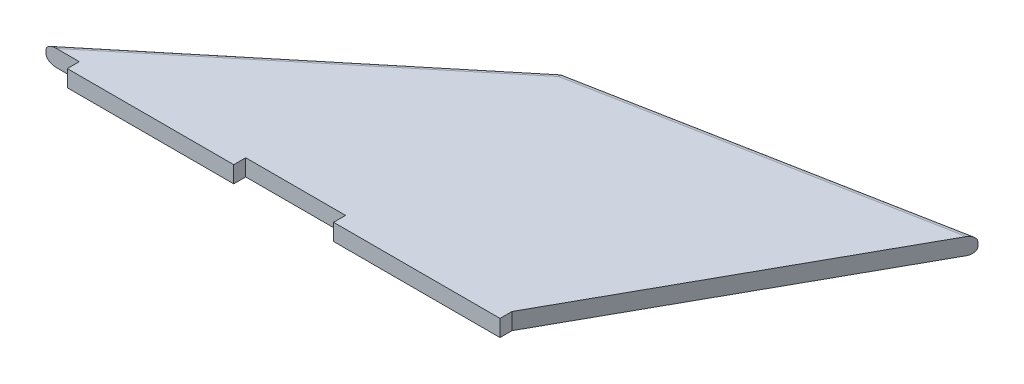
ISO-10303-21;
HEADER;
FILE_DESCRIPTION(('STEP AP214'),'2;1');
FILE_NAME('part.step','',(''),(''),'','','');
FILE_SCHEMA(('AUTOMOTIVE_DESIGN { 1 0 10303 214 1 1 1 1 }'));
ENDSEC;
DATA;
#1=APPLICATION_CONTEXT('core data for automotive mechanical design processes');
#2=APPLICATION_PROTOCOL_DEFINITION('international standard','automotive_design',2000,#1);
#3=PRODUCT_CONTEXT('',#1,'mechanical');
#4=PRODUCT('Part','Part','',(#3));
#5=PRODUCT_RELATED_PRODUCT_CATEGORY('part','',(#4));
#6=PRODUCT_DEFINITION_FORMATION('','',#4);
#7=PRODUCT_DEFINITION_CONTEXT('part definition',#1,'design');
#8=PRODUCT_DEFINITION('design','',#6,#7);
#9=PRODUCT_DEFINITION_SHAPE('','',#8);
#10=(LENGTH_UNIT() NAMED_UNIT(*) SI_UNIT(.MILLI.,.METRE.));
#11=(NAMED_UNIT(*) PLANE_ANGLE_UNIT() SI_UNIT($,.RADIAN.));
#12=(NAMED_UNIT(*) SI_UNIT($,.STERADIAN.) SOLID_ANGLE_UNIT());
#13=UNCERTAINTY_MEASURE_WITH_UNIT(LENGTH_MEASURE(1.E-05),#10,'distance_accuracy_value','');
#14=(GEOMETRIC_REPRESENTATION_CONTEXT(3) GLOBAL_UNCERTAINTY_ASSIGNED_CONTEXT((#13)) GLOBAL_UNIT_ASSIGNED_CONTEXT((#10,
#11,#12)) REPRESENTATION_CONTEXT('',''));
#15=CARTESIAN_POINT('',(0.,0.,0.));
#16=DIRECTION('',(0.,0.,1.));
#17=DIRECTION('',(1.,0.,0.));
#18=AXIS2_PLACEMENT_3D('',#15,#16,#17);
#19=CARTESIAN_POINT('',(5.,2.5,0.));
#20=DIRECTION('',(0.,0.,-1.));
#21=DIRECTION('',(-1.,0.,0.));
#22=AXIS2_PLACEMENT_3D('',#19,#20,#21);
#23=PLANE('',#22);
#24=DIRECTION('',(1.,0.,0.));
#25=VECTOR('',#24,1.);
#26=CARTESIAN_POINT('',(5.,2.5,0.));
#27=LINE('',#26,#25);
#28=CARTESIAN_POINT('',(1.57305111039609,2.5,0.));
#29=VERTEX_POINT('',#28);
#30=CARTESIAN_POINT('',(5.,2.5,0.));
#31=VERTEX_POINT('',#30);
#32=EDGE_CURVE('E141',#29,#31,#27,.T.);
#33=ORIENTED_EDGE('',*,*,#32,.F.);
#34=CARTESIAN_POINT('',(1.57305111039609,1.5,0.));
#35=DIRECTION('',(0.,0.,-1.));
#36=DIRECTION('',(1.,0.,0.));
#37=AXIS2_PLACEMENT_3D('',#34,#35,#36);
#38=ELLIPSE('',#37,1.57305111039609,1.);
#39=CARTESIAN_POINT('',(0.,1.5,0.));
#40=VERTEX_POINT('',#39);
#41=EDGE_CURVE('E187',#29,#40,#38,.F.);
#42=ORIENTED_EDGE('',*,*,#41,.T.);
#43=DIRECTION('',(0.,-1.,0.));
#44=VECTOR('',#43,1.);
#45=CARTESIAN_POINT('',(0.,2.5,0.));
#46=LINE('',#45,#44);
#47=CARTESIAN_POINT('',(0.,1.,0.));
#48=VERTEX_POINT('',#47);
#49=EDGE_CURVE('E229',#40,#48,#46,.T.);
#50=ORIENTED_EDGE('',*,*,#49,.T.);
#51=CARTESIAN_POINT('',(1.57305111039609,1.,0.));
#52=DIRECTION('',(0.,0.,-1.));
#53=DIRECTION('',(-1.,0.,0.));
#54=AXIS2_PLACEMENT_3D('',#51,#52,#53);
#55=ELLIPSE('',#54,1.57305111039609,1.);
#56=CARTESIAN_POINT('',(1.57305111039608,0.,0.));
#57=VERTEX_POINT('',#56);
#58=EDGE_CURVE('E185',#48,#57,#55,.F.);
#59=ORIENTED_EDGE('',*,*,#58,.T.);
#60=DIRECTION('',(1.,0.,0.));
#61=VECTOR('',#60,1.);
#62=CARTESIAN_POINT('',(5.,0.,0.));
#63=LINE('',#62,#61);
#64=CARTESIAN_POINT('',(5.,0.,0.));
#65=VERTEX_POINT('',#64);
#66=EDGE_CURVE('E162',#57,#65,#63,.T.);
#67=ORIENTED_EDGE('',*,*,#66,.T.);
#68=DIRECTION('',(0.,-1.,0.));
#69=VECTOR('',#68,1.);
#70=CARTESIAN_POINT('',(5.,2.5,0.));
#71=LINE('',#70,#69);
#72=EDGE_CURVE('E156',#31,#65,#71,.T.);
#73=ORIENTED_EDGE('',*,*,#72,.F.);
#74=EDGE_LOOP('',(#33,#42,#50,#59,#67,#73));
#75=FACE_BOUND('',#74,.T.);
#76=ADVANCED_FACE('F34',(#75),#23,.F.);
#77=CARTESIAN_POINT('',(5.,2.5,0.));
#78=DIRECTION('',(1.,0.,0.));
#79=DIRECTION('',(0.,0.,-1.));
#80=AXIS2_PLACEMENT_3D('',#77,#78,#79);
#81=PLANE('',#80);
#82=DIRECTION('',(0.,0.,1.));
#83=VECTOR('',#82,1.);
#84=CARTESIAN_POINT('',(5.,0.,0.));
#85=LINE('',#84,#83);
#86=CARTESIAN_POINT('',(5.,0.,1.80000000000001));
#87=VERTEX_POINT('',#86);
#88=EDGE_CURVE('E209',#65,#87,#85,.T.);
#89=ORIENTED_EDGE('',*,*,#88,.T.);
#90=DIRECTION('',(0.,-1.,0.));
#91=VECTOR('',#90,1.);
#92=CARTESIAN_POINT('',(5.,2.5,1.80000000000001));
#93=LINE('',#92,#91);
#94=CARTESIAN_POINT('',(5.,2.5,1.80000000000001));
#95=VERTEX_POINT('',#94);
#96=EDGE_CURVE('E158',#95,#87,#93,.T.);
#97=ORIENTED_EDGE('',*,*,#96,.F.);
#98=DIRECTION('',(0.,0.,1.));
#99=VECTOR('',#98,1.);
#100=CARTESIAN_POINT('',(5.,2.5,0.));
#101=LINE('',#100,#99);
#102=EDGE_CURVE('E144',#31,#95,#101,.T.);
#103=ORIENTED_EDGE('',*,*,#102,.F.);
#104=ORIENTED_EDGE('',*,*,#72,.T.);
#105=EDGE_LOOP('',(#89,#97,#103,#104));
#106=FACE_BOUND('',#105,.T.);
#107=ADVANCED_FACE('F155',(#106),#81,.F.);
#108=CARTESIAN_POINT('',(5.,2.5,1.80000000000001));
#109=DIRECTION('',(0.,0.,-1.));
#110=DIRECTION('',(-1.,0.,0.));
#111=AXIS2_PLACEMENT_3D('',#108,#109,#110);
#112=PLANE('',#111);
#113=DIRECTION('',(1.,0.,0.));
#114=VECTOR('',#113,1.);
#115=CARTESIAN_POINT('',(5.,0.,1.80000000000001));
#116=LINE('',#115,#114);
#117=CARTESIAN_POINT('',(30.,0.,1.80000000000001));
#118=VERTEX_POINT('',#117);
#119=EDGE_CURVE('E211',#87,#118,#116,.T.);
#120=ORIENTED_EDGE('',*,*,#119,.T.);
#121=DIRECTION('',(0.,-1.,0.));
#122=VECTOR('',#121,1.);
#123=CARTESIAN_POINT('',(30.,2.5,1.80000000000001));
#124=LINE('',#123,#122);
#125=CARTESIAN_POINT('',(30.,2.5,1.80000000000001));
#126=VERTEX_POINT('',#125);
#127=EDGE_CURVE('E168',#126,#118,#124,.T.);
#128=ORIENTED_EDGE('',*,*,#127,.F.);
#129=DIRECTION('',(1.,0.,0.));
#130=VECTOR('',#129,1.);
#131=CARTESIAN_POINT('',(5.,2.5,1.80000000000001));
#132=LINE('',#131,#130);
#133=EDGE_CURVE('E160',#95,#126,#132,.T.);
#134=ORIENTED_EDGE('',*,*,#133,.F.);
#135=ORIENTED_EDGE('',*,*,#96,.T.);
#136=EDGE_LOOP('',(#120,#128,#134,#135));
#137=FACE_BOUND('',#136,.T.);
#138=ADVANCED_FACE('F330',(#137),#112,.F.);
#139=CARTESIAN_POINT('',(30.,2.5,0.));
#140=DIRECTION('',(-1.,0.,0.));
#141=DIRECTION('',(0.,0.,1.));
#142=AXIS2_PLACEMENT_3D('',#139,#140,#141);
#143=PLANE('',#142);
#144=DIRECTION('',(0.,0.,-1.));
#145=VECTOR('',#144,1.);
#146=CARTESIAN_POINT('',(30.,0.,0.));
#147=LINE('',#146,#145);
#148=CARTESIAN_POINT('',(30.,0.,0.));
#149=VERTEX_POINT('',#148);
#150=EDGE_CURVE('E218',#118,#149,#147,.T.);
#151=ORIENTED_EDGE('',*,*,#150,.T.);
#152=DIRECTION('',(0.,-1.,0.));
#153=VECTOR('',#152,1.);
#154=CARTESIAN_POINT('',(30.,2.5,0.));
#155=LINE('',#154,#153);
#156=CARTESIAN_POINT('',(30.,2.5,0.));
#157=VERTEX_POINT('',#156);
#158=EDGE_CURVE('E247',#157,#149,#155,.T.);
#159=ORIENTED_EDGE('',*,*,#158,.F.);
#160=DIRECTION('',(0.,0.,-1.));
#161=VECTOR('',#160,1.);
#162=CARTESIAN_POINT('',(30.,2.5,0.));
#163=LINE('',#162,#161);
#164=EDGE_CURVE('E256',#126,#157,#163,.T.);
#165=ORIENTED_EDGE('',*,*,#164,.F.);
#166=ORIENTED_EDGE('',*,*,#127,.T.);
#167=EDGE_LOOP('',(#151,#159,#165,#166));
#168=FACE_BOUND('',#167,.T.);
#169=ADVANCED_FACE('F254',(#168),#143,.F.);
#170=CARTESIAN_POINT('',(45.,2.5,0.));
#171=DIRECTION('',(0.,0.,-1.));
#172=DIRECTION('',(-1.,0.,0.));
#173=AXIS2_PLACEMENT_3D('',#170,#171,#172);
#174=PLANE('',#173);
#175=DIRECTION('',(1.,0.,0.));
#176=VECTOR('',#175,1.);
#177=CARTESIAN_POINT('',(45.,0.,0.));
#178=LINE('',#177,#176);
#179=CARTESIAN_POINT('',(45.,0.,0.));
#180=VERTEX_POINT('',#179);
#181=EDGE_CURVE('E220',#149,#180,#178,.T.);
#182=ORIENTED_EDGE('',*,*,#181,.T.);
#183=DIRECTION('',(0.,-1.,0.));
#184=VECTOR('',#183,1.);
#185=CARTESIAN_POINT('',(45.,2.5,0.));
#186=LINE('',#185,#184);
#187=CARTESIAN_POINT('',(45.,2.5,0.));
#188=VERTEX_POINT('',#187);
#189=EDGE_CURVE('E244',#188,#180,#186,.T.);
#190=ORIENTED_EDGE('',*,*,#189,.F.);
#191=DIRECTION('',(1.,0.,0.));
#192=VECTOR('',#191,1.);
#193=CARTESIAN_POINT('',(45.,2.5,0.));
#194=LINE('',#193,#192);
#195=EDGE_CURVE('E274',#157,#188,#194,.T.);
#196=ORIENTED_EDGE('',*,*,#195,.F.);
#197=ORIENTED_EDGE('',*,*,#158,.T.);
#198=EDGE_LOOP('',(#182,#190,#196,#197));
#199=FACE_BOUND('',#198,.T.);
#200=ADVANCED_FACE('F265',(#199),#174,.F.);
#201=CARTESIAN_POINT('',(45.,2.5,0.));
#202=DIRECTION('',(1.,0.,0.));
#203=DIRECTION('',(0.,0.,-1.));
#204=AXIS2_PLACEMENT_3D('',#201,#202,#203);
#205=PLANE('',#204);
#206=DIRECTION('',(0.,0.,1.));
#207=VECTOR('',#206,1.);
#208=CARTESIAN_POINT('',(45.,0.,0.));
#209=LINE('',#208,#207);
#210=CARTESIAN_POINT('',(45.,0.,1.80000000000001));
#211=VERTEX_POINT('',#210);
#212=EDGE_CURVE('E222',#180,#211,#209,.T.);
#213=ORIENTED_EDGE('',*,*,#212,.T.);
#214=DIRECTION('',(0.,-1.,0.));
#215=VECTOR('',#214,1.);
#216=CARTESIAN_POINT('',(45.,2.5,1.80000000000001));
#217=LINE('',#216,#215);
#218=CARTESIAN_POINT('',(45.,2.5,1.80000000000001));
#219=VERTEX_POINT('',#218);
#220=EDGE_CURVE('E241',#219,#211,#217,.T.);
#221=ORIENTED_EDGE('',*,*,#220,.F.);
#222=DIRECTION('',(0.,0.,1.));
#223=VECTOR('',#222,1.);
#224=CARTESIAN_POINT('',(45.,2.5,0.));
#225=LINE('',#224,#223);
#226=EDGE_CURVE('E271',#188,#219,#225,.T.);
#227=ORIENTED_EDGE('',*,*,#226,.F.);
#228=ORIENTED_EDGE('',*,*,#189,.T.);
#229=EDGE_LOOP('',(#213,#221,#227,#228));
#230=FACE_BOUND('',#229,.T.);
#231=ADVANCED_FACE('F269',(#230),#205,.F.);
#232=CARTESIAN_POINT('',(45.,2.5,1.80000000000001));
#233=DIRECTION('',(0.,0.,-1.));
#234=DIRECTION('',(-1.,0.,0.));
#235=AXIS2_PLACEMENT_3D('',#232,#233,#234);
#236=PLANE('',#235);
#237=DIRECTION('',(1.,0.,0.));
#238=VECTOR('',#237,1.);
#239=CARTESIAN_POINT('',(45.,0.,1.80000000000001));
#240=LINE('',#239,#238);
#241=CARTESIAN_POINT('',(70.,0.,1.80000000000001));
#242=VERTEX_POINT('',#241);
#243=EDGE_CURVE('E224',#211,#242,#240,.T.);
#244=ORIENTED_EDGE('',*,*,#243,.T.);
#245=DIRECTION('',(0.,-1.,0.));
#246=VECTOR('',#245,1.);
#247=CARTESIAN_POINT('',(70.,2.5,1.80000000000001));
#248=LINE('',#247,#246);
#249=CARTESIAN_POINT('',(70.,2.5,1.80000000000001));
#250=VERTEX_POINT('',#249);
#251=EDGE_CURVE('E238',#250,#242,#248,.T.);
#252=ORIENTED_EDGE('',*,*,#251,.F.);
#253=DIRECTION('',(1.,0.,0.));
#254=VECTOR('',#253,1.);
#255=CARTESIAN_POINT('',(45.,2.5,1.80000000000001));
#256=LINE('',#255,#254);
#257=EDGE_CURVE('E273',#219,#250,#256,.T.);
#258=ORIENTED_EDGE('',*,*,#257,.F.);
#259=ORIENTED_EDGE('',*,*,#220,.T.);
#260=EDGE_LOOP('',(#244,#252,#258,#259));
#261=FACE_BOUND('',#260,.T.);
#262=ADVANCED_FACE('F428',(#261),#236,.F.);
#263=CARTESIAN_POINT('',(70.,2.5,0.));
#264=DIRECTION('',(-1.,0.,0.));
#265=DIRECTION('',(0.,0.,1.));
#266=AXIS2_PLACEMENT_3D('',#263,#264,#265);
#267=PLANE('',#266);
#268=DIRECTION('',(0.,0.,-1.));
#269=VECTOR('',#268,1.);
#270=CARTESIAN_POINT('',(70.,0.,0.));
#271=LINE('',#270,#269);
#272=CARTESIAN_POINT('',(70.,0.,0.));
#273=VERTEX_POINT('',#272);
#274=EDGE_CURVE('E226',#242,#273,#271,.T.);
#275=ORIENTED_EDGE('',*,*,#274,.T.);
#276=DIRECTION('',(0.,-1.,0.));
#277=VECTOR('',#276,1.);
#278=CARTESIAN_POINT('',(70.,2.5,0.));
#279=LINE('',#278,#277);
#280=CARTESIAN_POINT('',(70.,2.5,0.));
#281=VERTEX_POINT('',#280);
#282=EDGE_CURVE('E235',#281,#273,#279,.T.);
#283=ORIENTED_EDGE('',*,*,#282,.F.);
#284=DIRECTION('',(0.,0.,-1.));
#285=VECTOR('',#284,1.);
#286=CARTESIAN_POINT('',(70.,2.5,0.));
#287=LINE('',#286,#285);
#288=EDGE_CURVE('E276',#250,#281,#287,.T.);
#289=ORIENTED_EDGE('',*,*,#288,.F.);
#290=ORIENTED_EDGE('',*,*,#251,.T.);
#291=EDGE_LOOP('',(#275,#283,#289,#290));
#292=FACE_BOUND('',#291,.T.);
#293=ADVANCED_FACE('F413',(#292),#267,.F.);
#294=CARTESIAN_POINT('',(95.,2.5,-45.));
#295=DIRECTION('',(-0.874157276121538,0.,-0.485642931178632));
#296=DIRECTION('',(-0.485642931178632,0.,0.874157276121538));
#297=AXIS2_PLACEMENT_3D('',#294,#295,#296);
#298=PLANE('',#297);
#299=DIRECTION('',(0.485642931178632,0.,-0.874157276121538));
#300=VECTOR('',#299,1.);
#301=CARTESIAN_POINT('',(95.,0.,-45.));
#302=LINE('',#301,#300);
#303=CARTESIAN_POINT('',(94.3675278601647,0.,-43.8615501482965));
#304=VERTEX_POINT('',#303);
#305=EDGE_CURVE('E151',#273,#304,#302,.T.);
#306=ORIENTED_EDGE('',*,*,#305,.T.);
#307=CARTESIAN_POINT('',(94.3675278601647,1.,-43.8615501482965));
#308=DIRECTION('',(-0.874157276121538,0.,-0.485642931178632));
#309=DIRECTION('',(-0.485642931178632,0.,0.874157276121538));
#310=AXIS2_PLACEMENT_3D('',#307,#308,#309);
#311=ELLIPSE('',#310,1.3023398452445,1.);
#312=CARTESIAN_POINT('',(95.,1.,-45.));
#313=VERTEX_POINT('',#312);
#314=EDGE_CURVE('E11',#304,#313,#311,.F.);
#315=ORIENTED_EDGE('',*,*,#314,.T.);
#316=DIRECTION('',(0.,-1.,0.));
#317=VECTOR('',#316,1.);
#318=CARTESIAN_POINT('',(95.,2.5,-45.));
#319=LINE('',#318,#317);
#320=CARTESIAN_POINT('',(95.,1.5,-45.));
#321=VERTEX_POINT('',#320);
#322=EDGE_CURVE('E232',#321,#313,#319,.T.);
#323=ORIENTED_EDGE('',*,*,#322,.F.);
#324=CARTESIAN_POINT('',(94.3675278601647,1.5,-43.8615501482965));
#325=DIRECTION('',(-0.874157276121538,0.,-0.485642931178632));
#326=DIRECTION('',(0.485642931178632,0.,-0.874157276121538));
#327=AXIS2_PLACEMENT_3D('',#324,#325,#326);
#328=ELLIPSE('',#327,1.3023398452445,1.);
#329=CARTESIAN_POINT('',(94.3675278601647,2.5,-43.8615501482965));
#330=VERTEX_POINT('',#329);
#331=EDGE_CURVE('E43',#321,#330,#328,.F.);
#332=ORIENTED_EDGE('',*,*,#331,.T.);
#333=DIRECTION('',(0.485642931178632,0.,-0.874157276121538));
#334=VECTOR('',#333,1.);
#335=CARTESIAN_POINT('',(95.,2.5,-45.));
#336=LINE('',#335,#334);
#337=EDGE_CURVE('E214',#281,#330,#336,.T.);
#338=ORIENTED_EDGE('',*,*,#337,.F.);
#339=ORIENTED_EDGE('',*,*,#282,.T.);
#340=EDGE_LOOP('',(#306,#315,#323,#332,#338,#339));
#341=FACE_BOUND('',#340,.T.);
#342=ADVANCED_FACE('F294',(#341),#298,.F.);
#343=CARTESIAN_POINT('',(42.5,2.5,-35.));
#344=DIRECTION('',(0.187112107889995,0.,0.982338566422475));
#345=DIRECTION('',(0.982338566422475,0.,-0.187112107889995));
#346=AXIS2_PLACEMENT_3D('',#343,#344,#345);
#347=PLANE('',#346);
#348=ORIENTED_EDGE('',*,*,#322,.T.);
#349=DIRECTION('',(-0.982338566422475,0.,0.187112107889995));
#350=VECTOR('',#349,1.);
#351=CARTESIAN_POINT('',(42.5,1.,-35.));
#352=LINE('',#351,#350);
#353=CARTESIAN_POINT('',(42.7511999934689,1.,-35.0478476178036));
#354=VERTEX_POINT('',#353);
#355=EDGE_CURVE('E180',#313,#354,#352,.T.);
#356=ORIENTED_EDGE('',*,*,#355,.T.);
#357=DIRECTION('',(0.,-1.,0.));
#358=VECTOR('',#357,1.);
#359=CARTESIAN_POINT('',(42.7511999934689,2.5,-35.0478476178036));
#360=LINE('',#359,#358);
#361=CARTESIAN_POINT('',(42.7511999934689,1.5,-35.0478476178036));
#362=VERTEX_POINT('',#361);
#363=EDGE_CURVE('E178',#354,#362,#360,.F.);
#364=ORIENTED_EDGE('',*,*,#363,.T.);
#365=DIRECTION('',(-0.982338566422475,0.,0.187112107889995));
#366=VECTOR('',#365,1.);
#367=CARTESIAN_POINT('',(95.,1.5,-45.));
#368=LINE('',#367,#366);
#369=EDGE_CURVE('E176',#362,#321,#368,.F.);
#370=ORIENTED_EDGE('',*,*,#369,.T.);
#371=EDGE_LOOP('',(#348,#356,#364,#370));
#372=FACE_BOUND('',#371,.T.);
#373=ADVANCED_FACE('F291',(#372),#347,.F.);
#374=CARTESIAN_POINT('',(0.,2.5,0.));
#375=DIRECTION('',(0.6357072528611,0.,0.77193023561705));
#376=DIRECTION('',(0.77193023561705,0.,-0.6357072528611));
#377=AXIS2_PLACEMENT_3D('',#374,#375,#376);
#378=PLANE('',#377);
#379=ORIENTED_EDGE('',*,*,#49,.F.);
#380=DIRECTION('',(-0.77193023561705,0.,0.6357072528611));
#381=VECTOR('',#380,1.);
#382=CARTESIAN_POINT('',(42.5,1.5,-35.));
#383=LINE('',#382,#381);
#384=CARTESIAN_POINT('',(42.3026048484978,1.5,-34.8374392869982));
#385=VERTEX_POINT('',#384);
#386=EDGE_CURVE('E174',#40,#385,#383,.F.);
#387=ORIENTED_EDGE('',*,*,#386,.T.);
#388=DIRECTION('',(0.,-1.,0.));
#389=VECTOR('',#388,1.);
#390=CARTESIAN_POINT('',(42.3026048484978,2.5,-34.8374392869982));
#391=LINE('',#390,#389);
#392=CARTESIAN_POINT('',(42.3026048484978,1.,-34.8374392869982));
#393=VERTEX_POINT('',#392);
#394=EDGE_CURVE('E166',#385,#393,#391,.T.);
#395=ORIENTED_EDGE('',*,*,#394,.T.);
#396=DIRECTION('',(-0.77193023561705,0.,0.6357072528611));
#397=VECTOR('',#396,1.);
#398=CARTESIAN_POINT('',(0.,1.,0.));
#399=LINE('',#398,#397);
#400=EDGE_CURVE('E164',#393,#48,#399,.T.);
#401=ORIENTED_EDGE('',*,*,#400,.T.);
#402=EDGE_LOOP('',(#379,#387,#395,#401));
#403=FACE_BOUND('',#402,.T.);
#404=ADVANCED_FACE('F312',(#403),#378,.F.);
#405=CARTESIAN_POINT('',(0.,2.5,0.));
#406=DIRECTION('',(0.,1.,0.));
#407=DIRECTION('',(0.,0.,1.));
#408=AXIS2_PLACEMENT_3D('',#405,#406,#407);
#409=PLANE('',#408);
#410=DIRECTION('',(-0.982338566422475,0.,0.187112107889995));
#411=VECTOR('',#410,1.);
#412=CARTESIAN_POINT('',(42.68711210789,2.5,-34.0176614335775));
#413=LINE('',#412,#411);
#414=CARTESIAN_POINT('',(42.9383121013589,2.5,-34.0655090513811));
#415=VERTEX_POINT('',#414);
#416=EDGE_CURVE('E182',#330,#415,#413,.T.);
#417=ORIENTED_EDGE('',*,*,#416,.T.);
#418=DIRECTION('',(-0.77193023561705,0.,0.6357072528611));
#419=VECTOR('',#418,1.);
#420=CARTESIAN_POINT('',(0.6357072528611,2.5,0.77193023561705));
#421=LINE('',#420,#419);
#422=EDGE_CURVE('E147',#415,#29,#421,.T.);
#423=ORIENTED_EDGE('',*,*,#422,.T.);
#424=ORIENTED_EDGE('',*,*,#32,.T.);
#425=ORIENTED_EDGE('',*,*,#102,.T.);
#426=ORIENTED_EDGE('',*,*,#133,.T.);
#427=ORIENTED_EDGE('',*,*,#164,.T.);
#428=ORIENTED_EDGE('',*,*,#195,.T.);
#429=ORIENTED_EDGE('',*,*,#226,.T.);
#430=ORIENTED_EDGE('',*,*,#257,.T.);
#431=ORIENTED_EDGE('',*,*,#288,.T.);
#432=ORIENTED_EDGE('',*,*,#337,.T.);
#433=EDGE_LOOP('',(#417,#423,#424,#425,#426,#427,#428,#429,#430,#431,#432));
#434=FACE_BOUND('',#433,.T.);
#435=ADVANCED_FACE('F143',(#434),#409,.T.);
#436=CARTESIAN_POINT('',(0.,0.,0.));
#437=DIRECTION('',(0.,1.,0.));
#438=DIRECTION('',(0.,0.,1.));
#439=AXIS2_PLACEMENT_3D('',#436,#437,#438);
#440=PLANE('',#439);
#441=ORIENTED_EDGE('',*,*,#66,.F.);
#442=DIRECTION('',(-0.77193023561705,0.,0.6357072528611));
#443=VECTOR('',#442,1.);
#444=CARTESIAN_POINT('',(0.635707252861096,0.,0.771930235617045));
#445=LINE('',#444,#443);
#446=CARTESIAN_POINT('',(42.9383121013589,0.,-34.0655090513811));
#447=VERTEX_POINT('',#446);
#448=EDGE_CURVE('E51',#57,#447,#445,.F.);
#449=ORIENTED_EDGE('',*,*,#448,.T.);
#450=DIRECTION('',(-0.982338566422475,0.,0.187112107889995));
#451=VECTOR('',#450,1.);
#452=CARTESIAN_POINT('',(-4.75818329692401,0.,-24.980462308851));
#453=LINE('',#452,#451);
#454=EDGE_CURVE('E55',#447,#304,#453,.F.);
#455=ORIENTED_EDGE('',*,*,#454,.T.);
#456=ORIENTED_EDGE('',*,*,#305,.F.);
#457=ORIENTED_EDGE('',*,*,#274,.F.);
#458=ORIENTED_EDGE('',*,*,#243,.F.);
#459=ORIENTED_EDGE('',*,*,#212,.F.);
#460=ORIENTED_EDGE('',*,*,#181,.F.);
#461=ORIENTED_EDGE('',*,*,#150,.F.);
#462=ORIENTED_EDGE('',*,*,#119,.F.);
#463=ORIENTED_EDGE('',*,*,#88,.F.);
#464=EDGE_LOOP('',(#441,#449,#455,#456,#457,#458,#459,#460,#461,#462,#463));
#465=FACE_BOUND('',#464,.T.);
#466=ADVANCED_FACE('F260',(#465),#440,.F.);
#467=CARTESIAN_POINT('',(-4.75818329692401,1.5,-24.9804623088511));
#468=DIRECTION('',(0.982338566422475,0.,-0.187112107889995));
#469=DIRECTION('',(-0.187112107889995,0.,-0.982338566422475));
#470=AXIS2_PLACEMENT_3D('',#467,#468,#469);
#471=CYLINDRICAL_SURFACE('',#470,1.);
#472=ORIENTED_EDGE('',*,*,#331,.F.);
#473=ORIENTED_EDGE('',*,*,#369,.F.);
#474=CARTESIAN_POINT('',(42.9383121013589,1.5,-34.0655090513811));
#475=DIRECTION('',(-0.982338566422477,0.,0.187112107889985));
#476=DIRECTION('',(0.187112107889985,0.,0.982338566422477));
#477=AXIS2_PLACEMENT_3D('',#474,#475,#476);
#478=CIRCLE('',#477,1.);
#479=EDGE_CURVE('E38',#415,#362,#478,.T.);
#480=ORIENTED_EDGE('',*,*,#479,.F.);
#481=ORIENTED_EDGE('',*,*,#416,.F.);
#482=EDGE_LOOP('',(#472,#473,#480,#481));
#483=FACE_BOUND('',#482,.T.);
#484=ADVANCED_FACE('F36',(#483),#471,.T.);
#485=CARTESIAN_POINT('',(0.6357072528611,1.5,0.77193023561705));
#486=DIRECTION('',(0.77193023561705,0.,-0.6357072528611));
#487=DIRECTION('',(-0.6357072528611,0.,-0.77193023561705));
#488=AXIS2_PLACEMENT_3D('',#485,#486,#487);
#489=CYLINDRICAL_SURFACE('',#488,1.);
#490=ORIENTED_EDGE('',*,*,#41,.F.);
#491=ORIENTED_EDGE('',*,*,#422,.F.);
#492=CARTESIAN_POINT('',(42.9383121013589,1.5,-34.0655090513811));
#493=DIRECTION('',(0.77193023561705,0.,-0.635707252861099));
#494=DIRECTION('',(-0.635707252861099,0.,-0.77193023561705));
#495=AXIS2_PLACEMENT_3D('',#492,#493,#494);
#496=CIRCLE('',#495,1.);
#497=EDGE_CURVE('E202',#385,#415,#496,.T.);
#498=ORIENTED_EDGE('',*,*,#497,.F.);
#499=ORIENTED_EDGE('',*,*,#386,.F.);
#500=EDGE_LOOP('',(#490,#491,#498,#499));
#501=FACE_BOUND('',#500,.T.);
#502=ADVANCED_FACE('F315',(#501),#489,.T.);
#503=CARTESIAN_POINT('',(0.6357072528611,1.,0.77193023561705));
#504=DIRECTION('',(-0.77193023561705,0.,0.6357072528611));
#505=DIRECTION('',(0.6357072528611,0.,0.77193023561705));
#506=AXIS2_PLACEMENT_3D('',#503,#504,#505);
#507=CYLINDRICAL_SURFACE('',#506,1.);
#508=ORIENTED_EDGE('',*,*,#58,.F.);
#509=ORIENTED_EDGE('',*,*,#400,.F.);
#510=CARTESIAN_POINT('',(42.9383121013589,1.,-34.0655090513811));
#511=DIRECTION('',(0.77193023561706,0.,-0.635707252861087));
#512=DIRECTION('',(-0.635707252861087,0.,-0.77193023561706));
#513=AXIS2_PLACEMENT_3D('',#510,#511,#512);
#514=CIRCLE('',#513,1.);
#515=EDGE_CURVE('E200',#447,#393,#514,.T.);
#516=ORIENTED_EDGE('',*,*,#515,.F.);
#517=ORIENTED_EDGE('',*,*,#448,.F.);
#518=EDGE_LOOP('',(#508,#509,#516,#517));
#519=FACE_BOUND('',#518,.T.);
#520=ADVANCED_FACE('F309',(#519),#507,.T.);
#521=CARTESIAN_POINT('',(42.68711210789,1.,-34.0176614335775));
#522=DIRECTION('',(-0.982338566422475,0.,0.187112107889995));
#523=DIRECTION('',(0.187112107889995,0.,0.982338566422475));
#524=AXIS2_PLACEMENT_3D('',#521,#522,#523);
#525=CYLINDRICAL_SURFACE('',#524,1.);
#526=ORIENTED_EDGE('',*,*,#314,.F.);
#527=ORIENTED_EDGE('',*,*,#454,.F.);
#528=CARTESIAN_POINT('',(42.9383121013589,1.,-34.0655090513811));
#529=DIRECTION('',(-0.982338566422475,0.,0.187112107889991));
#530=DIRECTION('',(0.187112107889991,0.,0.982338566422476));
#531=AXIS2_PLACEMENT_3D('',#528,#529,#530);
#532=CIRCLE('',#531,1.);
#533=EDGE_CURVE('E197',#354,#447,#532,.T.);
#534=ORIENTED_EDGE('',*,*,#533,.F.);
#535=ORIENTED_EDGE('',*,*,#355,.F.);
#536=EDGE_LOOP('',(#526,#527,#534,#535));
#537=FACE_BOUND('',#536,.T.);
#538=ADVANCED_FACE('F297',(#537),#525,.T.);
#539=CARTESIAN_POINT('',(42.9383121013589,1.5,-34.0655090513811));
#540=DIRECTION('',(0.,0.,1.));
#541=DIRECTION('',(1.,0.,0.));
#542=AXIS2_PLACEMENT_3D('',#539,#540,#541);
#543=SPHERICAL_SURFACE('',#542,1.);
#544=ORIENTED_EDGE('',*,*,#497,.T.);
#545=ORIENTED_EDGE('',*,*,#479,.T.);
#546=CARTESIAN_POINT('',(42.9383121013589,1.5,-34.0655090513811));
#547=DIRECTION('',(0.,1.,0.));
#548=DIRECTION('',(0.,0.,1.));
#549=AXIS2_PLACEMENT_3D('',#546,#547,#548);
#550=CIRCLE('',#549,1.);
#551=EDGE_CURVE('E194',#385,#362,#550,.F.);
#552=ORIENTED_EDGE('',*,*,#551,.F.);
#553=EDGE_LOOP('',(#544,#545,#552));
#554=FACE_BOUND('',#553,.T.);
#555=ADVANCED_FACE('F316',(#554),#543,.T.);
#556=CARTESIAN_POINT('',(42.9383121013589,1.,-34.0655090513811));
#557=DIRECTION('',(0.,0.,1.));
#558=DIRECTION('',(1.,0.,0.));
#559=AXIS2_PLACEMENT_3D('',#556,#557,#558);
#560=SPHERICAL_SURFACE('',#559,1.);
#561=ORIENTED_EDGE('',*,*,#533,.T.);
#562=ORIENTED_EDGE('',*,*,#515,.T.);
#563=CARTESIAN_POINT('',(42.9383121013589,1.,-34.0655090513811));
#564=DIRECTION('',(0.,-1.,0.));
#565=DIRECTION('',(0.,0.,-1.));
#566=AXIS2_PLACEMENT_3D('',#563,#564,#565);
#567=CIRCLE('',#566,1.);
#568=EDGE_CURVE('E192',#354,#393,#567,.F.);
#569=ORIENTED_EDGE('',*,*,#568,.F.);
#570=EDGE_LOOP('',(#561,#562,#569));
#571=FACE_BOUND('',#570,.T.);
#572=ADVANCED_FACE('F305',(#571),#560,.T.);
#573=CARTESIAN_POINT('',(42.9383121013589,2.5,-34.0655090513811));
#574=DIRECTION('',(0.,-1.,0.));
#575=DIRECTION('',(0.,0.,-1.));
#576=AXIS2_PLACEMENT_3D('',#573,#574,#575);
#577=CYLINDRICAL_SURFACE('',#576,1.);
#578=ORIENTED_EDGE('',*,*,#551,.T.);
#579=ORIENTED_EDGE('',*,*,#363,.F.);
#580=ORIENTED_EDGE('',*,*,#568,.T.);
#581=ORIENTED_EDGE('',*,*,#394,.F.);
#582=EDGE_LOOP('',(#578,#579,#580,#581));
#583=FACE_BOUND('',#582,.T.);
#584=ADVANCED_FACE('F303',(#583),#577,.T.);
#585=CLOSED_SHELL('',(#76,#107,#138,#169,#200,#231,#262,#293,#342,#373,#404,#435,#466,#484,#502,
#520,#538,#555,#572,#584));
#586=MANIFOLD_SOLID_BREP('B2',#585);
#587=ADVANCED_BREP_SHAPE_REPRESENTATION('',(#18,#586),#14);
#588=SHAPE_DEFINITION_REPRESENTATION(#9,#587);
ENDSEC;
END-ISO-10303-21;
